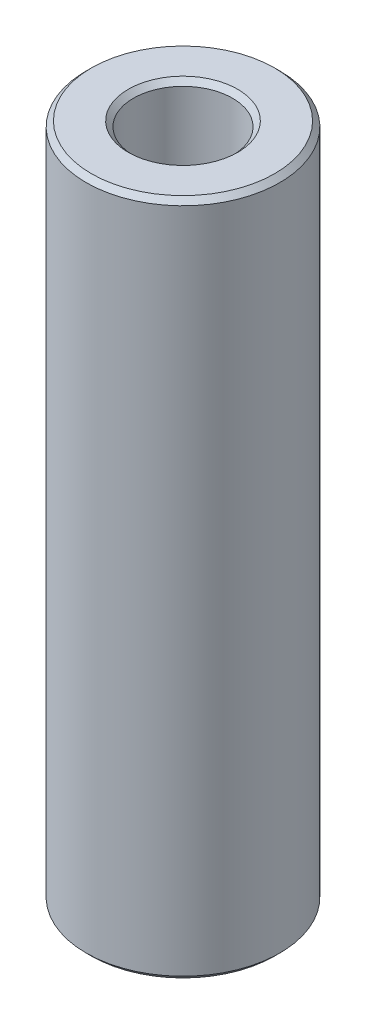
ISO-10303-21;
HEADER;
FILE_DESCRIPTION(('STEP AP214'),'2;1');
FILE_NAME('part.step','',(''),(''),'','','');
FILE_SCHEMA(('AUTOMOTIVE_DESIGN { 1 0 10303 214 1 1 1 1 }'));
ENDSEC;
DATA;
#1=APPLICATION_CONTEXT('core data for automotive mechanical design processes');
#2=APPLICATION_PROTOCOL_DEFINITION('international standard','automotive_design',2000,#1);
#3=PRODUCT_CONTEXT('',#1,'mechanical');
#4=PRODUCT('Part','Part','',(#3));
#5=PRODUCT_RELATED_PRODUCT_CATEGORY('part','',(#4));
#6=PRODUCT_DEFINITION_FORMATION('','',#4);
#7=PRODUCT_DEFINITION_CONTEXT('part definition',#1,'design');
#8=PRODUCT_DEFINITION('design','',#6,#7);
#9=PRODUCT_DEFINITION_SHAPE('','',#8);
#10=(LENGTH_UNIT() NAMED_UNIT(*) SI_UNIT(.MILLI.,.METRE.));
#11=(NAMED_UNIT(*) PLANE_ANGLE_UNIT() SI_UNIT($,.RADIAN.));
#12=(NAMED_UNIT(*) SI_UNIT($,.STERADIAN.) SOLID_ANGLE_UNIT());
#13=UNCERTAINTY_MEASURE_WITH_UNIT(LENGTH_MEASURE(1.E-05),#10,'distance_accuracy_value','');
#14=(GEOMETRIC_REPRESENTATION_CONTEXT(3) GLOBAL_UNCERTAINTY_ASSIGNED_CONTEXT((#13)) GLOBAL_UNIT_ASSIGNED_CONTEXT((#10,
#11,#12)) REPRESENTATION_CONTEXT('',''));
#15=CARTESIAN_POINT('',(0.,0.,0.));
#16=DIRECTION('',(0.,0.,1.));
#17=DIRECTION('',(1.,0.,0.));
#18=AXIS2_PLACEMENT_3D('',#15,#16,#17);
#19=CARTESIAN_POINT('',(0.,33.0835,0.));
#20=DIRECTION('',(0.,1.,0.));
#21=DIRECTION('',(0.,0.,1.));
#22=AXIS2_PLACEMENT_3D('',#19,#20,#21);
#23=CONICAL_SURFACE('',#22,2.4384,0.785398163397449);
#24=CARTESIAN_POINT('',(0.,33.0835,0.));
#25=DIRECTION('',(0.,1.,0.));
#26=DIRECTION('',(0.,0.,1.));
#27=AXIS2_PLACEMENT_3D('',#24,#25,#26);
#28=CIRCLE('',#27,2.4384);
#29=CARTESIAN_POINT('',(0.,33.0835,2.4384));
#30=VERTEX_POINT('',#29);
#31=EDGE_CURVE('E27',#30,#30,#28,.T.);
#32=ORIENTED_EDGE('',*,*,#31,.F.);
#33=EDGE_LOOP('',(#32));
#34=FACE_BOUND('',#33,.T.);
#35=CARTESIAN_POINT('',(0.,33.3375,0.));
#36=DIRECTION('',(0.,-1.,0.));
#37=DIRECTION('',(0.,0.,1.));
#38=AXIS2_PLACEMENT_3D('',#35,#36,#37);
#39=CIRCLE('',#38,2.6924);
#40=CARTESIAN_POINT('',(0.,33.3375,2.6924));
#41=VERTEX_POINT('',#40);
#42=EDGE_CURVE('E20',#41,#41,#39,.T.);
#43=ORIENTED_EDGE('',*,*,#42,.F.);
#44=EDGE_LOOP('',(#43));
#45=FACE_BOUND('',#44,.T.);
#46=ADVANCED_FACE('F16',(#34,#45),#23,.F.);
#47=CARTESIAN_POINT('',(0.,0.,0.));
#48=DIRECTION('',(0.,-1.,0.));
#49=DIRECTION('',(0.,0.,-1.));
#50=AXIS2_PLACEMENT_3D('',#47,#48,#49);
#51=CONICAL_SURFACE('',#50,2.6924,0.785398163397449);
#52=CARTESIAN_POINT('',(0.,0.254000000000004,0.));
#53=DIRECTION('',(0.,-1.,0.));
#54=DIRECTION('',(0.,0.,1.));
#55=AXIS2_PLACEMENT_3D('',#52,#53,#54);
#56=CIRCLE('',#55,2.4384);
#57=CARTESIAN_POINT('',(0.,0.254000000000004,2.4384));
#58=VERTEX_POINT('',#57);
#59=EDGE_CURVE('E11',#58,#58,#56,.T.);
#60=ORIENTED_EDGE('',*,*,#59,.F.);
#61=EDGE_LOOP('',(#60));
#62=FACE_BOUND('',#61,.T.);
#63=CARTESIAN_POINT('',(0.,0.,0.));
#64=DIRECTION('',(0.,1.,0.));
#65=DIRECTION('',(0.,0.,1.));
#66=AXIS2_PLACEMENT_3D('',#63,#64,#65);
#67=CIRCLE('',#66,2.6924);
#68=CARTESIAN_POINT('',(0.,0.,2.6924));
#69=VERTEX_POINT('',#68);
#70=EDGE_CURVE('E97',#69,#69,#67,.T.);
#71=ORIENTED_EDGE('',*,*,#70,.F.);
#72=EDGE_LOOP('',(#71));
#73=FACE_BOUND('',#72,.T.);
#74=ADVANCED_FACE('F147',(#62,#73),#51,.F.);
#75=CARTESIAN_POINT('',(0.,33.3375,0.));
#76=DIRECTION('',(0.,-1.,0.));
#77=DIRECTION('',(0.,0.,-1.));
#78=AXIS2_PLACEMENT_3D('',#75,#76,#77);
#79=CONICAL_SURFACE('',#78,4.5085,0.78539816339745);
#80=CARTESIAN_POINT('',(0.,33.3375,0.));
#81=DIRECTION('',(0.,1.,0.));
#82=DIRECTION('',(0.,0.,1.));
#83=AXIS2_PLACEMENT_3D('',#80,#81,#82);
#84=CIRCLE('',#83,4.5085);
#85=CARTESIAN_POINT('',(0.,33.3375,4.5085));
#86=VERTEX_POINT('',#85);
#87=EDGE_CURVE('E57',#86,#86,#84,.T.);
#88=ORIENTED_EDGE('',*,*,#87,.F.);
#89=EDGE_LOOP('',(#88));
#90=FACE_BOUND('',#89,.T.);
#91=CARTESIAN_POINT('',(0.,33.0835,0.));
#92=DIRECTION('',(0.,-1.,0.));
#93=DIRECTION('',(0.,0.,1.));
#94=AXIS2_PLACEMENT_3D('',#91,#92,#93);
#95=CIRCLE('',#94,4.7625);
#96=CARTESIAN_POINT('',(0.,33.0835,4.7625));
#97=VERTEX_POINT('',#96);
#98=EDGE_CURVE('E80',#97,#97,#95,.T.);
#99=ORIENTED_EDGE('',*,*,#98,.F.);
#100=EDGE_LOOP('',(#99));
#101=FACE_BOUND('',#100,.T.);
#102=ADVANCED_FACE('F152',(#90,#101),#79,.T.);
#103=CARTESIAN_POINT('',(0.,0.254000000000004,0.));
#104=DIRECTION('',(0.,1.,0.));
#105=DIRECTION('',(0.,0.,1.));
#106=AXIS2_PLACEMENT_3D('',#103,#104,#105);
#107=CONICAL_SURFACE('',#106,4.7625,0.785398163397443);
#108=CARTESIAN_POINT('',(0.,0.,0.));
#109=DIRECTION('',(0.,-1.,0.));
#110=DIRECTION('',(0.,0.,1.));
#111=AXIS2_PLACEMENT_3D('',#108,#109,#110);
#112=CIRCLE('',#111,4.5085);
#113=CARTESIAN_POINT('',(0.,0.,4.5085));
#114=VERTEX_POINT('',#113);
#115=EDGE_CURVE('E72',#114,#114,#112,.T.);
#116=ORIENTED_EDGE('',*,*,#115,.F.);
#117=EDGE_LOOP('',(#116));
#118=FACE_BOUND('',#117,.T.);
#119=CARTESIAN_POINT('',(0.,0.254000000000004,0.));
#120=DIRECTION('',(0.,1.,0.));
#121=DIRECTION('',(0.,0.,1.));
#122=AXIS2_PLACEMENT_3D('',#119,#120,#121);
#123=CIRCLE('',#122,4.7625);
#124=CARTESIAN_POINT('',(0.,0.254000000000004,4.7625));
#125=VERTEX_POINT('',#124);
#126=EDGE_CURVE('E86',#125,#125,#123,.T.);
#127=ORIENTED_EDGE('',*,*,#126,.F.);
#128=EDGE_LOOP('',(#127));
#129=FACE_BOUND('',#128,.T.);
#130=ADVANCED_FACE('F175',(#118,#129),#107,.T.);
#131=CARTESIAN_POINT('',(0.,33.3375,0.));
#132=DIRECTION('',(0.,-1.,0.));
#133=DIRECTION('',(0.,0.,-1.));
#134=AXIS2_PLACEMENT_3D('',#131,#132,#133);
#135=CYLINDRICAL_SURFACE('',#134,2.4384);
#136=ORIENTED_EDGE('',*,*,#59,.T.);
#137=EDGE_LOOP('',(#136));
#138=FACE_BOUND('',#137,.T.);
#139=ORIENTED_EDGE('',*,*,#31,.T.);
#140=EDGE_LOOP('',(#139));
#141=FACE_BOUND('',#140,.T.);
#142=ADVANCED_FACE('F18',(#138,#141),#135,.F.);
#143=CARTESIAN_POINT('',(0.,33.3375,0.));
#144=DIRECTION('',(0.,-1.,0.));
#145=DIRECTION('',(0.,0.,-1.));
#146=AXIS2_PLACEMENT_3D('',#143,#144,#145);
#147=CYLINDRICAL_SURFACE('',#146,4.7625);
#148=ORIENTED_EDGE('',*,*,#126,.T.);
#149=EDGE_LOOP('',(#148));
#150=FACE_BOUND('',#149,.T.);
#151=ORIENTED_EDGE('',*,*,#98,.T.);
#152=EDGE_LOOP('',(#151));
#153=FACE_BOUND('',#152,.T.);
#154=ADVANCED_FACE('F87',(#150,#153),#147,.T.);
#155=CARTESIAN_POINT('',(0.,0.,0.));
#156=DIRECTION('',(0.,1.,0.));
#157=DIRECTION('',(1.,0.,0.));
#158=AXIS2_PLACEMENT_3D('',#155,#156,#157);
#159=PLANE('',#158);
#160=ORIENTED_EDGE('',*,*,#70,.T.);
#161=EDGE_LOOP('',(#160));
#162=FACE_BOUND('',#161,.T.);
#163=ORIENTED_EDGE('',*,*,#115,.T.);
#164=EDGE_LOOP('',(#163));
#165=FACE_BOUND('',#164,.T.);
#166=ADVANCED_FACE('F165',(#162,#165),#159,.F.);
#167=CARTESIAN_POINT('',(0.,33.3375,0.));
#168=DIRECTION('',(0.,1.,0.));
#169=DIRECTION('',(1.,0.,0.));
#170=AXIS2_PLACEMENT_3D('',#167,#168,#169);
#171=PLANE('',#170);
#172=ORIENTED_EDGE('',*,*,#42,.T.);
#173=EDGE_LOOP('',(#172));
#174=FACE_BOUND('',#173,.T.);
#175=ORIENTED_EDGE('',*,*,#87,.T.);
#176=EDGE_LOOP('',(#175));
#177=FACE_BOUND('',#176,.T.);
#178=ADVANCED_FACE('F161',(#174,#177),#171,.T.);
#179=CLOSED_SHELL('',(#46,#74,#102,#130,#142,#154,#166,#178));
#180=MANIFOLD_SOLID_BREP('B1',#179);
#181=ADVANCED_BREP_SHAPE_REPRESENTATION('',(#18,#180),#14);
#182=SHAPE_DEFINITION_REPRESENTATION(#9,#181);
ENDSEC;
END-ISO-10303-21;
